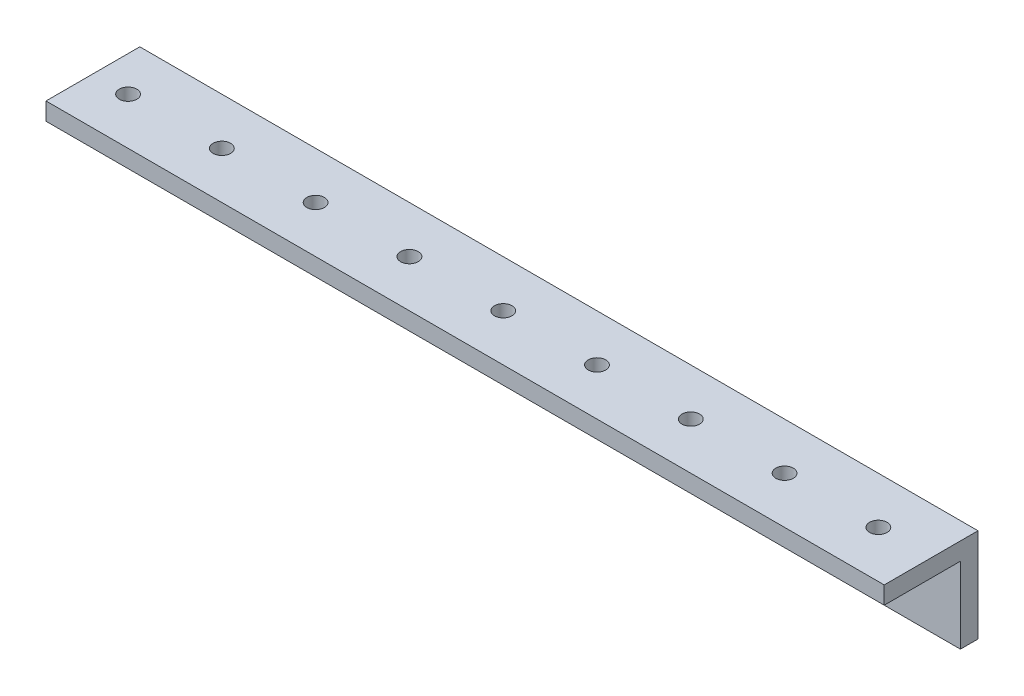
ISO-10303-21;
HEADER;
FILE_DESCRIPTION(('STEP AP214'),'2;1');
FILE_NAME('part.step','',(''),(''),'','','');
FILE_SCHEMA(('AUTOMOTIVE_DESIGN { 1 0 10303 214 1 1 1 1 }'));
ENDSEC;
DATA;
#1=APPLICATION_CONTEXT('core data for automotive mechanical design processes');
#2=APPLICATION_PROTOCOL_DEFINITION('international standard','automotive_design',2000,#1);
#3=PRODUCT_CONTEXT('',#1,'mechanical');
#4=PRODUCT('Part','Part','',(#3));
#5=PRODUCT_RELATED_PRODUCT_CATEGORY('part','',(#4));
#6=PRODUCT_DEFINITION_FORMATION('','',#4);
#7=PRODUCT_DEFINITION_CONTEXT('part definition',#1,'design');
#8=PRODUCT_DEFINITION('design','',#6,#7);
#9=PRODUCT_DEFINITION_SHAPE('','',#8);
#10=(LENGTH_UNIT() NAMED_UNIT(*) SI_UNIT(.MILLI.,.METRE.));
#11=(NAMED_UNIT(*) PLANE_ANGLE_UNIT() SI_UNIT($,.RADIAN.));
#12=(NAMED_UNIT(*) SI_UNIT($,.STERADIAN.) SOLID_ANGLE_UNIT());
#13=UNCERTAINTY_MEASURE_WITH_UNIT(LENGTH_MEASURE(1.E-05),#10,'distance_accuracy_value','');
#14=(GEOMETRIC_REPRESENTATION_CONTEXT(3) GLOBAL_UNCERTAINTY_ASSIGNED_CONTEXT((#13)) GLOBAL_UNIT_ASSIGNED_CONTEXT((#10,
#11,#12)) REPRESENTATION_CONTEXT('',''));
#15=CARTESIAN_POINT('',(0.,0.,0.));
#16=DIRECTION('',(0.,0.,1.));
#17=DIRECTION('',(1.,0.,0.));
#18=AXIS2_PLACEMENT_3D('',#15,#16,#17);
#19=CARTESIAN_POINT('',(5.99999999999998,6.,8.));
#20=DIRECTION('',(0.,1.,0.));
#21=DIRECTION('',(0.,0.,1.));
#22=AXIS2_PLACEMENT_3D('',#19,#20,#21);
#23=CYLINDRICAL_SURFACE('',#22,1.5);
#24=CARTESIAN_POINT('',(5.99999999999998,16.,8.));
#25=DIRECTION('',(0.,1.,0.));
#26=DIRECTION('',(0.,0.,1.));
#27=AXIS2_PLACEMENT_3D('',#24,#25,#26);
#28=CIRCLE('',#27,1.5);
#29=CARTESIAN_POINT('',(5.99999999999998,16.,9.5));
#30=VERTEX_POINT('',#29);
#31=EDGE_CURVE('E40',#30,#30,#28,.T.);
#32=ORIENTED_EDGE('',*,*,#31,.T.);
#33=EDGE_LOOP('',(#32));
#34=FACE_BOUND('',#33,.T.);
#35=CARTESIAN_POINT('',(5.99999999999998,13.,8.));
#36=DIRECTION('',(0.,1.,0.));
#37=DIRECTION('',(0.,0.,1.));
#38=AXIS2_PLACEMENT_3D('',#35,#36,#37);
#39=CIRCLE('',#38,1.5);
#40=CARTESIAN_POINT('',(5.99999999999998,13.,9.5));
#41=VERTEX_POINT('',#40);
#42=EDGE_CURVE('E11',#41,#41,#39,.T.);
#43=ORIENTED_EDGE('',*,*,#42,.F.);
#44=EDGE_LOOP('',(#43));
#45=FACE_BOUND('',#44,.T.);
#46=ADVANCED_FACE('F33',(#34,#45),#23,.F.);
#47=CARTESIAN_POINT('',(22.,6.,8.));
#48=DIRECTION('',(0.,1.,0.));
#49=DIRECTION('',(0.,0.,1.));
#50=AXIS2_PLACEMENT_3D('',#47,#48,#49);
#51=CYLINDRICAL_SURFACE('',#50,1.5);
#52=CARTESIAN_POINT('',(22.,16.,8.));
#53=DIRECTION('',(0.,1.,0.));
#54=DIRECTION('',(0.,0.,1.));
#55=AXIS2_PLACEMENT_3D('',#52,#53,#54);
#56=CIRCLE('',#55,1.5);
#57=CARTESIAN_POINT('',(22.,16.,9.5));
#58=VERTEX_POINT('',#57);
#59=EDGE_CURVE('E196',#58,#58,#56,.T.);
#60=ORIENTED_EDGE('',*,*,#59,.T.);
#61=EDGE_LOOP('',(#60));
#62=FACE_BOUND('',#61,.T.);
#63=CARTESIAN_POINT('',(22.,13.,8.));
#64=DIRECTION('',(0.,1.,0.));
#65=DIRECTION('',(0.,0.,1.));
#66=AXIS2_PLACEMENT_3D('',#63,#64,#65);
#67=CIRCLE('',#66,1.5);
#68=CARTESIAN_POINT('',(22.,13.,9.5));
#69=VERTEX_POINT('',#68);
#70=EDGE_CURVE('E199',#69,#69,#67,.T.);
#71=ORIENTED_EDGE('',*,*,#70,.F.);
#72=EDGE_LOOP('',(#71));
#73=FACE_BOUND('',#72,.T.);
#74=ADVANCED_FACE('F225',(#62,#73),#51,.F.);
#75=CARTESIAN_POINT('',(38.,6.,8.));
#76=DIRECTION('',(0.,1.,0.));
#77=DIRECTION('',(0.,0.,1.));
#78=AXIS2_PLACEMENT_3D('',#75,#76,#77);
#79=CYLINDRICAL_SURFACE('',#78,1.5);
#80=CARTESIAN_POINT('',(38.,16.,8.));
#81=DIRECTION('',(0.,1.,0.));
#82=DIRECTION('',(0.,0.,1.));
#83=AXIS2_PLACEMENT_3D('',#80,#81,#82);
#84=CIRCLE('',#83,1.5);
#85=CARTESIAN_POINT('',(38.,16.,9.5));
#86=VERTEX_POINT('',#85);
#87=EDGE_CURVE('E190',#86,#86,#84,.T.);
#88=ORIENTED_EDGE('',*,*,#87,.T.);
#89=EDGE_LOOP('',(#88));
#90=FACE_BOUND('',#89,.T.);
#91=CARTESIAN_POINT('',(38.,13.,8.));
#92=DIRECTION('',(0.,1.,0.));
#93=DIRECTION('',(0.,0.,1.));
#94=AXIS2_PLACEMENT_3D('',#91,#92,#93);
#95=CIRCLE('',#94,1.5);
#96=CARTESIAN_POINT('',(38.,13.,9.5));
#97=VERTEX_POINT('',#96);
#98=EDGE_CURVE('E193',#97,#97,#95,.T.);
#99=ORIENTED_EDGE('',*,*,#98,.F.);
#100=EDGE_LOOP('',(#99));
#101=FACE_BOUND('',#100,.T.);
#102=ADVANCED_FACE('F230',(#90,#101),#79,.F.);
#103=CARTESIAN_POINT('',(54.,6.,8.));
#104=DIRECTION('',(0.,1.,0.));
#105=DIRECTION('',(0.,0.,1.));
#106=AXIS2_PLACEMENT_3D('',#103,#104,#105);
#107=CYLINDRICAL_SURFACE('',#106,1.5);
#108=CARTESIAN_POINT('',(54.,16.,8.));
#109=DIRECTION('',(0.,1.,0.));
#110=DIRECTION('',(0.,0.,1.));
#111=AXIS2_PLACEMENT_3D('',#108,#109,#110);
#112=CIRCLE('',#111,1.5);
#113=CARTESIAN_POINT('',(54.,16.,9.5));
#114=VERTEX_POINT('',#113);
#115=EDGE_CURVE('E184',#114,#114,#112,.T.);
#116=ORIENTED_EDGE('',*,*,#115,.T.);
#117=EDGE_LOOP('',(#116));
#118=FACE_BOUND('',#117,.T.);
#119=CARTESIAN_POINT('',(54.,13.,8.));
#120=DIRECTION('',(0.,1.,0.));
#121=DIRECTION('',(0.,0.,1.));
#122=AXIS2_PLACEMENT_3D('',#119,#120,#121);
#123=CIRCLE('',#122,1.5);
#124=CARTESIAN_POINT('',(54.,13.,9.5));
#125=VERTEX_POINT('',#124);
#126=EDGE_CURVE('E187',#125,#125,#123,.T.);
#127=ORIENTED_EDGE('',*,*,#126,.F.);
#128=EDGE_LOOP('',(#127));
#129=FACE_BOUND('',#128,.T.);
#130=ADVANCED_FACE('F235',(#118,#129),#107,.F.);
#131=CARTESIAN_POINT('',(70.,6.,8.));
#132=DIRECTION('',(0.,1.,0.));
#133=DIRECTION('',(0.,0.,1.));
#134=AXIS2_PLACEMENT_3D('',#131,#132,#133);
#135=CYLINDRICAL_SURFACE('',#134,1.5);
#136=CARTESIAN_POINT('',(70.,16.,8.));
#137=DIRECTION('',(0.,1.,0.));
#138=DIRECTION('',(0.,0.,1.));
#139=AXIS2_PLACEMENT_3D('',#136,#137,#138);
#140=CIRCLE('',#139,1.5);
#141=CARTESIAN_POINT('',(70.,16.,9.5));
#142=VERTEX_POINT('',#141);
#143=EDGE_CURVE('E178',#142,#142,#140,.T.);
#144=ORIENTED_EDGE('',*,*,#143,.T.);
#145=EDGE_LOOP('',(#144));
#146=FACE_BOUND('',#145,.T.);
#147=CARTESIAN_POINT('',(70.,13.,8.));
#148=DIRECTION('',(0.,1.,0.));
#149=DIRECTION('',(0.,0.,1.));
#150=AXIS2_PLACEMENT_3D('',#147,#148,#149);
#151=CIRCLE('',#150,1.5);
#152=CARTESIAN_POINT('',(70.,13.,9.5));
#153=VERTEX_POINT('',#152);
#154=EDGE_CURVE('E181',#153,#153,#151,.T.);
#155=ORIENTED_EDGE('',*,*,#154,.F.);
#156=EDGE_LOOP('',(#155));
#157=FACE_BOUND('',#156,.T.);
#158=ADVANCED_FACE('F242',(#146,#157),#135,.F.);
#159=CARTESIAN_POINT('',(86.,6.,8.));
#160=DIRECTION('',(0.,1.,0.));
#161=DIRECTION('',(0.,0.,1.));
#162=AXIS2_PLACEMENT_3D('',#159,#160,#161);
#163=CYLINDRICAL_SURFACE('',#162,1.5);
#164=CARTESIAN_POINT('',(86.,16.,8.));
#165=DIRECTION('',(0.,1.,0.));
#166=DIRECTION('',(0.,0.,1.));
#167=AXIS2_PLACEMENT_3D('',#164,#165,#166);
#168=CIRCLE('',#167,1.5);
#169=CARTESIAN_POINT('',(86.,16.,9.5));
#170=VERTEX_POINT('',#169);
#171=EDGE_CURVE('E172',#170,#170,#168,.T.);
#172=ORIENTED_EDGE('',*,*,#171,.T.);
#173=EDGE_LOOP('',(#172));
#174=FACE_BOUND('',#173,.T.);
#175=CARTESIAN_POINT('',(86.,13.,8.));
#176=DIRECTION('',(0.,1.,0.));
#177=DIRECTION('',(0.,0.,1.));
#178=AXIS2_PLACEMENT_3D('',#175,#176,#177);
#179=CIRCLE('',#178,1.5);
#180=CARTESIAN_POINT('',(86.,13.,9.5));
#181=VERTEX_POINT('',#180);
#182=EDGE_CURVE('E175',#181,#181,#179,.T.);
#183=ORIENTED_EDGE('',*,*,#182,.F.);
#184=EDGE_LOOP('',(#183));
#185=FACE_BOUND('',#184,.T.);
#186=ADVANCED_FACE('F246',(#174,#185),#163,.F.);
#187=CARTESIAN_POINT('',(102.,6.,8.));
#188=DIRECTION('',(0.,1.,0.));
#189=DIRECTION('',(0.,0.,1.));
#190=AXIS2_PLACEMENT_3D('',#187,#188,#189);
#191=CYLINDRICAL_SURFACE('',#190,1.5);
#192=CARTESIAN_POINT('',(102.,16.,8.));
#193=DIRECTION('',(0.,1.,0.));
#194=DIRECTION('',(0.,0.,1.));
#195=AXIS2_PLACEMENT_3D('',#192,#193,#194);
#196=CIRCLE('',#195,1.5);
#197=CARTESIAN_POINT('',(102.,16.,9.5));
#198=VERTEX_POINT('',#197);
#199=EDGE_CURVE('E161',#198,#198,#196,.T.);
#200=ORIENTED_EDGE('',*,*,#199,.T.);
#201=EDGE_LOOP('',(#200));
#202=FACE_BOUND('',#201,.T.);
#203=CARTESIAN_POINT('',(102.,13.,8.));
#204=DIRECTION('',(0.,1.,0.));
#205=DIRECTION('',(0.,0.,1.));
#206=AXIS2_PLACEMENT_3D('',#203,#204,#205);
#207=CIRCLE('',#206,1.5);
#208=CARTESIAN_POINT('',(102.,13.,9.5));
#209=VERTEX_POINT('',#208);
#210=EDGE_CURVE('E169',#209,#209,#207,.T.);
#211=ORIENTED_EDGE('',*,*,#210,.F.);
#212=EDGE_LOOP('',(#211));
#213=FACE_BOUND('',#212,.T.);
#214=ADVANCED_FACE('F250',(#202,#213),#191,.F.);
#215=CARTESIAN_POINT('',(5.99999999999998,8.,10.));
#216=DIRECTION('',(0.,0.,-1.));
#217=DIRECTION('',(-1.,0.,0.));
#218=AXIS2_PLACEMENT_3D('',#215,#216,#217);
#219=CYLINDRICAL_SURFACE('',#218,1.5);
#220=CARTESIAN_POINT('',(5.99999999999998,8.,0.));
#221=DIRECTION('',(0.,0.,-1.));
#222=DIRECTION('',(-1.,0.,0.));
#223=AXIS2_PLACEMENT_3D('',#220,#221,#222);
#224=CIRCLE('',#223,1.5);
#225=CARTESIAN_POINT('',(4.49999999999998,8.,0.));
#226=VERTEX_POINT('',#225);
#227=EDGE_CURVE('E155',#226,#226,#224,.T.);
#228=ORIENTED_EDGE('',*,*,#227,.T.);
#229=EDGE_LOOP('',(#228));
#230=FACE_BOUND('',#229,.T.);
#231=CARTESIAN_POINT('',(5.99999999999998,8.,3.));
#232=DIRECTION('',(0.,0.,-1.));
#233=DIRECTION('',(-1.,0.,0.));
#234=AXIS2_PLACEMENT_3D('',#231,#232,#233);
#235=CIRCLE('',#234,1.5);
#236=CARTESIAN_POINT('',(4.49999999999998,8.,3.));
#237=VERTEX_POINT('',#236);
#238=EDGE_CURVE('E158',#237,#237,#235,.T.);
#239=ORIENTED_EDGE('',*,*,#238,.F.);
#240=EDGE_LOOP('',(#239));
#241=FACE_BOUND('',#240,.T.);
#242=ADVANCED_FACE('F254',(#230,#241),#219,.F.);
#243=CARTESIAN_POINT('',(22.,8.,10.));
#244=DIRECTION('',(0.,0.,-1.));
#245=DIRECTION('',(-1.,0.,0.));
#246=AXIS2_PLACEMENT_3D('',#243,#244,#245);
#247=CYLINDRICAL_SURFACE('',#246,1.5);
#248=CARTESIAN_POINT('',(22.,8.,0.));
#249=DIRECTION('',(0.,0.,-1.));
#250=DIRECTION('',(-1.,0.,0.));
#251=AXIS2_PLACEMENT_3D('',#248,#249,#250);
#252=CIRCLE('',#251,1.5);
#253=CARTESIAN_POINT('',(20.5,8.,0.));
#254=VERTEX_POINT('',#253);
#255=EDGE_CURVE('E149',#254,#254,#252,.T.);
#256=ORIENTED_EDGE('',*,*,#255,.T.);
#257=EDGE_LOOP('',(#256));
#258=FACE_BOUND('',#257,.T.);
#259=CARTESIAN_POINT('',(22.,8.,3.));
#260=DIRECTION('',(0.,0.,-1.));
#261=DIRECTION('',(-1.,0.,0.));
#262=AXIS2_PLACEMENT_3D('',#259,#260,#261);
#263=CIRCLE('',#262,1.5);
#264=CARTESIAN_POINT('',(20.5,8.,3.));
#265=VERTEX_POINT('',#264);
#266=EDGE_CURVE('E152',#265,#265,#263,.T.);
#267=ORIENTED_EDGE('',*,*,#266,.F.);
#268=EDGE_LOOP('',(#267));
#269=FACE_BOUND('',#268,.T.);
#270=ADVANCED_FACE('F258',(#258,#269),#247,.F.);
#271=CARTESIAN_POINT('',(38.,8.,10.));
#272=DIRECTION('',(0.,0.,-1.));
#273=DIRECTION('',(-1.,0.,0.));
#274=AXIS2_PLACEMENT_3D('',#271,#272,#273);
#275=CYLINDRICAL_SURFACE('',#274,1.5);
#276=CARTESIAN_POINT('',(38.,8.,0.));
#277=DIRECTION('',(0.,0.,-1.));
#278=DIRECTION('',(-1.,0.,0.));
#279=AXIS2_PLACEMENT_3D('',#276,#277,#278);
#280=CIRCLE('',#279,1.5);
#281=CARTESIAN_POINT('',(36.5,8.,0.));
#282=VERTEX_POINT('',#281);
#283=EDGE_CURVE('E143',#282,#282,#280,.T.);
#284=ORIENTED_EDGE('',*,*,#283,.T.);
#285=EDGE_LOOP('',(#284));
#286=FACE_BOUND('',#285,.T.);
#287=CARTESIAN_POINT('',(38.,8.,3.));
#288=DIRECTION('',(0.,0.,-1.));
#289=DIRECTION('',(-1.,0.,0.));
#290=AXIS2_PLACEMENT_3D('',#287,#288,#289);
#291=CIRCLE('',#290,1.5);
#292=CARTESIAN_POINT('',(36.5,8.,3.));
#293=VERTEX_POINT('',#292);
#294=EDGE_CURVE('E146',#293,#293,#291,.T.);
#295=ORIENTED_EDGE('',*,*,#294,.F.);
#296=EDGE_LOOP('',(#295));
#297=FACE_BOUND('',#296,.T.);
#298=ADVANCED_FACE('F262',(#286,#297),#275,.F.);
#299=CARTESIAN_POINT('',(54.,8.,10.));
#300=DIRECTION('',(0.,0.,-1.));
#301=DIRECTION('',(-1.,0.,0.));
#302=AXIS2_PLACEMENT_3D('',#299,#300,#301);
#303=CYLINDRICAL_SURFACE('',#302,1.5);
#304=CARTESIAN_POINT('',(54.,8.,0.));
#305=DIRECTION('',(0.,0.,-1.));
#306=DIRECTION('',(-1.,0.,0.));
#307=AXIS2_PLACEMENT_3D('',#304,#305,#306);
#308=CIRCLE('',#307,1.5);
#309=CARTESIAN_POINT('',(52.5,8.,0.));
#310=VERTEX_POINT('',#309);
#311=EDGE_CURVE('E137',#310,#310,#308,.T.);
#312=ORIENTED_EDGE('',*,*,#311,.T.);
#313=EDGE_LOOP('',(#312));
#314=FACE_BOUND('',#313,.T.);
#315=CARTESIAN_POINT('',(54.,8.,3.));
#316=DIRECTION('',(0.,0.,-1.));
#317=DIRECTION('',(-1.,0.,0.));
#318=AXIS2_PLACEMENT_3D('',#315,#316,#317);
#319=CIRCLE('',#318,1.5);
#320=CARTESIAN_POINT('',(52.5,8.,3.));
#321=VERTEX_POINT('',#320);
#322=EDGE_CURVE('E140',#321,#321,#319,.T.);
#323=ORIENTED_EDGE('',*,*,#322,.F.);
#324=EDGE_LOOP('',(#323));
#325=FACE_BOUND('',#324,.T.);
#326=ADVANCED_FACE('F266',(#314,#325),#303,.F.);
#327=CARTESIAN_POINT('',(70.,8.,10.));
#328=DIRECTION('',(0.,0.,-1.));
#329=DIRECTION('',(-1.,0.,0.));
#330=AXIS2_PLACEMENT_3D('',#327,#328,#329);
#331=CYLINDRICAL_SURFACE('',#330,1.5);
#332=CARTESIAN_POINT('',(70.,8.,0.));
#333=DIRECTION('',(0.,0.,-1.));
#334=DIRECTION('',(-1.,0.,0.));
#335=AXIS2_PLACEMENT_3D('',#332,#333,#334);
#336=CIRCLE('',#335,1.5);
#337=CARTESIAN_POINT('',(68.5,8.,0.));
#338=VERTEX_POINT('',#337);
#339=EDGE_CURVE('E131',#338,#338,#336,.T.);
#340=ORIENTED_EDGE('',*,*,#339,.T.);
#341=EDGE_LOOP('',(#340));
#342=FACE_BOUND('',#341,.T.);
#343=CARTESIAN_POINT('',(70.,8.,3.));
#344=DIRECTION('',(0.,0.,-1.));
#345=DIRECTION('',(-1.,0.,0.));
#346=AXIS2_PLACEMENT_3D('',#343,#344,#345);
#347=CIRCLE('',#346,1.5);
#348=CARTESIAN_POINT('',(68.5,8.,3.));
#349=VERTEX_POINT('',#348);
#350=EDGE_CURVE('E134',#349,#349,#347,.T.);
#351=ORIENTED_EDGE('',*,*,#350,.F.);
#352=EDGE_LOOP('',(#351));
#353=FACE_BOUND('',#352,.T.);
#354=ADVANCED_FACE('F270',(#342,#353),#331,.F.);
#355=CARTESIAN_POINT('',(86.,8.,10.));
#356=DIRECTION('',(0.,0.,-1.));
#357=DIRECTION('',(-1.,0.,0.));
#358=AXIS2_PLACEMENT_3D('',#355,#356,#357);
#359=CYLINDRICAL_SURFACE('',#358,1.5);
#360=CARTESIAN_POINT('',(86.,8.,0.));
#361=DIRECTION('',(0.,0.,-1.));
#362=DIRECTION('',(-1.,0.,0.));
#363=AXIS2_PLACEMENT_3D('',#360,#361,#362);
#364=CIRCLE('',#363,1.5);
#365=CARTESIAN_POINT('',(84.5,8.,0.));
#366=VERTEX_POINT('',#365);
#367=EDGE_CURVE('E125',#366,#366,#364,.T.);
#368=ORIENTED_EDGE('',*,*,#367,.T.);
#369=EDGE_LOOP('',(#368));
#370=FACE_BOUND('',#369,.T.);
#371=CARTESIAN_POINT('',(86.,8.,3.));
#372=DIRECTION('',(0.,0.,-1.));
#373=DIRECTION('',(-1.,0.,0.));
#374=AXIS2_PLACEMENT_3D('',#371,#372,#373);
#375=CIRCLE('',#374,1.5);
#376=CARTESIAN_POINT('',(84.5,8.,3.));
#377=VERTEX_POINT('',#376);
#378=EDGE_CURVE('E128',#377,#377,#375,.T.);
#379=ORIENTED_EDGE('',*,*,#378,.F.);
#380=EDGE_LOOP('',(#379));
#381=FACE_BOUND('',#380,.T.);
#382=ADVANCED_FACE('F274',(#370,#381),#359,.F.);
#383=CARTESIAN_POINT('',(102.,8.,10.));
#384=DIRECTION('',(0.,0.,-1.));
#385=DIRECTION('',(-1.,0.,0.));
#386=AXIS2_PLACEMENT_3D('',#383,#384,#385);
#387=CYLINDRICAL_SURFACE('',#386,1.5);
#388=CARTESIAN_POINT('',(102.,8.,0.));
#389=DIRECTION('',(0.,0.,-1.));
#390=DIRECTION('',(-1.,0.,0.));
#391=AXIS2_PLACEMENT_3D('',#388,#389,#390);
#392=CIRCLE('',#391,1.5);
#393=CARTESIAN_POINT('',(100.5,8.,0.));
#394=VERTEX_POINT('',#393);
#395=EDGE_CURVE('E119',#394,#394,#392,.T.);
#396=ORIENTED_EDGE('',*,*,#395,.T.);
#397=EDGE_LOOP('',(#396));
#398=FACE_BOUND('',#397,.T.);
#399=CARTESIAN_POINT('',(102.,8.,3.));
#400=DIRECTION('',(0.,0.,-1.));
#401=DIRECTION('',(-1.,0.,0.));
#402=AXIS2_PLACEMENT_3D('',#399,#400,#401);
#403=CIRCLE('',#402,1.5);
#404=CARTESIAN_POINT('',(100.5,8.,3.));
#405=VERTEX_POINT('',#404);
#406=EDGE_CURVE('E122',#405,#405,#403,.T.);
#407=ORIENTED_EDGE('',*,*,#406,.F.);
#408=EDGE_LOOP('',(#407));
#409=FACE_BOUND('',#408,.T.);
#410=ADVANCED_FACE('F278',(#398,#409),#387,.F.);
#411=CARTESIAN_POINT('',(0.,0.,3.));
#412=DIRECTION('',(0.,0.,-1.));
#413=DIRECTION('',(-1.,0.,0.));
#414=AXIS2_PLACEMENT_3D('',#411,#412,#413);
#415=PLANE('',#414);
#416=CARTESIAN_POINT('',(118.,8.,3.));
#417=DIRECTION('',(0.,0.,-1.));
#418=DIRECTION('',(-1.,0.,0.));
#419=AXIS2_PLACEMENT_3D('',#416,#417,#418);
#420=CIRCLE('',#419,1.5);
#421=CARTESIAN_POINT('',(116.5,8.,3.));
#422=VERTEX_POINT('',#421);
#423=EDGE_CURVE('E314',#422,#422,#420,.T.);
#424=ORIENTED_EDGE('',*,*,#423,.T.);
#425=EDGE_LOOP('',(#424));
#426=FACE_BOUND('',#425,.T.);
#427=CARTESIAN_POINT('',(134.,8.,3.));
#428=DIRECTION('',(0.,0.,-1.));
#429=DIRECTION('',(-1.,0.,0.));
#430=AXIS2_PLACEMENT_3D('',#427,#428,#429);
#431=CIRCLE('',#430,1.5);
#432=CARTESIAN_POINT('',(132.5,8.,3.));
#433=VERTEX_POINT('',#432);
#434=EDGE_CURVE('E300',#433,#433,#431,.T.);
#435=ORIENTED_EDGE('',*,*,#434,.T.);
#436=EDGE_LOOP('',(#435));
#437=FACE_BOUND('',#436,.T.);
#438=DIRECTION('',(1.,0.,0.));
#439=VECTOR('',#438,1.);
#440=CARTESIAN_POINT('',(0.,13.,3.));
#441=LINE('',#440,#439);
#442=CARTESIAN_POINT('',(0.,13.,3.));
#443=VERTEX_POINT('',#442);
#444=CARTESIAN_POINT('',(143.,13.,3.));
#445=VERTEX_POINT('',#444);
#446=EDGE_CURVE('E47',#443,#445,#441,.T.);
#447=ORIENTED_EDGE('',*,*,#446,.F.);
#448=DIRECTION('',(0.,-1.,0.));
#449=VECTOR('',#448,1.);
#450=CARTESIAN_POINT('',(0.,0.,3.));
#451=LINE('',#450,#449);
#452=CARTESIAN_POINT('',(0.,0.,3.));
#453=VERTEX_POINT('',#452);
#454=EDGE_CURVE('E85',#443,#453,#451,.T.);
#455=ORIENTED_EDGE('',*,*,#454,.T.);
#456=DIRECTION('',(1.,0.,0.));
#457=VECTOR('',#456,1.);
#458=CARTESIAN_POINT('',(0.,0.,3.));
#459=LINE('',#458,#457);
#460=CARTESIAN_POINT('',(143.,0.,3.));
#461=VERTEX_POINT('',#460);
#462=EDGE_CURVE('E53',#453,#461,#459,.T.);
#463=ORIENTED_EDGE('',*,*,#462,.T.);
#464=DIRECTION('',(0.,1.,0.));
#465=VECTOR('',#464,1.);
#466=CARTESIAN_POINT('',(143.,0.,3.));
#467=LINE('',#466,#465);
#468=EDGE_CURVE('E97',#461,#445,#467,.T.);
#469=ORIENTED_EDGE('',*,*,#468,.T.);
#470=EDGE_LOOP('',(#447,#455,#463,#469));
#471=FACE_BOUND('',#470,.T.);
#472=ORIENTED_EDGE('',*,*,#406,.T.);
#473=EDGE_LOOP('',(#472));
#474=FACE_BOUND('',#473,.T.);
#475=ORIENTED_EDGE('',*,*,#378,.T.);
#476=EDGE_LOOP('',(#475));
#477=FACE_BOUND('',#476,.T.);
#478=ORIENTED_EDGE('',*,*,#350,.T.);
#479=EDGE_LOOP('',(#478));
#480=FACE_BOUND('',#479,.T.);
#481=ORIENTED_EDGE('',*,*,#322,.T.);
#482=EDGE_LOOP('',(#481));
#483=FACE_BOUND('',#482,.T.);
#484=ORIENTED_EDGE('',*,*,#294,.T.);
#485=EDGE_LOOP('',(#484));
#486=FACE_BOUND('',#485,.T.);
#487=ORIENTED_EDGE('',*,*,#266,.T.);
#488=EDGE_LOOP('',(#487));
#489=FACE_BOUND('',#488,.T.);
#490=ORIENTED_EDGE('',*,*,#238,.T.);
#491=EDGE_LOOP('',(#490));
#492=FACE_BOUND('',#491,.T.);
#493=ADVANCED_FACE('F282',(#426,#437,#471,#474,#477,#480,#483,#486,#489,#492),#415,.F.);
#494=CARTESIAN_POINT('',(0.,0.,3.));
#495=DIRECTION('',(1.,0.,0.));
#496=DIRECTION('',(0.,0.,-1.));
#497=AXIS2_PLACEMENT_3D('',#494,#495,#496);
#498=PLANE('',#497);
#499=DIRECTION('',(0.,-1.,0.));
#500=VECTOR('',#499,1.);
#501=CARTESIAN_POINT('',(0.,0.,0.));
#502=LINE('',#501,#500);
#503=CARTESIAN_POINT('',(0.,16.,0.));
#504=VERTEX_POINT('',#503);
#505=CARTESIAN_POINT('',(0.,0.,0.));
#506=VERTEX_POINT('',#505);
#507=EDGE_CURVE('E93',#504,#506,#502,.T.);
#508=ORIENTED_EDGE('',*,*,#507,.T.);
#509=DIRECTION('',(0.,0.,-1.));
#510=VECTOR('',#509,1.);
#511=CARTESIAN_POINT('',(0.,0.,3.));
#512=LINE('',#511,#510);
#513=EDGE_CURVE('E117',#453,#506,#512,.T.);
#514=ORIENTED_EDGE('',*,*,#513,.F.);
#515=ORIENTED_EDGE('',*,*,#454,.F.);
#516=DIRECTION('',(0.,0.,-1.));
#517=VECTOR('',#516,1.);
#518=CARTESIAN_POINT('',(0.,13.,16.));
#519=LINE('',#518,#517);
#520=CARTESIAN_POINT('',(0.,13.,16.));
#521=VERTEX_POINT('',#520);
#522=EDGE_CURVE('E103',#521,#443,#519,.T.);
#523=ORIENTED_EDGE('',*,*,#522,.F.);
#524=DIRECTION('',(0.,-1.,0.));
#525=VECTOR('',#524,1.);
#526=CARTESIAN_POINT('',(0.,16.,16.));
#527=LINE('',#526,#525);
#528=CARTESIAN_POINT('',(0.,16.,16.));
#529=VERTEX_POINT('',#528);
#530=EDGE_CURVE('E96',#529,#521,#527,.T.);
#531=ORIENTED_EDGE('',*,*,#530,.F.);
#532=DIRECTION('',(0.,0.,-1.));
#533=VECTOR('',#532,1.);
#534=CARTESIAN_POINT('',(0.,16.,3.));
#535=LINE('',#534,#533);
#536=EDGE_CURVE('E78',#529,#504,#535,.T.);
#537=ORIENTED_EDGE('',*,*,#536,.T.);
#538=EDGE_LOOP('',(#508,#514,#515,#523,#531,#537));
#539=FACE_BOUND('',#538,.T.);
#540=ADVANCED_FACE('F91',(#539),#498,.F.);
#541=CARTESIAN_POINT('',(0.,0.,3.));
#542=DIRECTION('',(0.,1.,0.));
#543=DIRECTION('',(0.,0.,1.));
#544=AXIS2_PLACEMENT_3D('',#541,#542,#543);
#545=PLANE('',#544);
#546=DIRECTION('',(1.,0.,0.));
#547=VECTOR('',#546,1.);
#548=CARTESIAN_POINT('',(0.,0.,0.));
#549=LINE('',#548,#547);
#550=CARTESIAN_POINT('',(143.,0.,0.));
#551=VERTEX_POINT('',#550);
#552=EDGE_CURVE('E101',#506,#551,#549,.T.);
#553=ORIENTED_EDGE('',*,*,#552,.T.);
#554=DIRECTION('',(0.,0.,-1.));
#555=VECTOR('',#554,1.);
#556=CARTESIAN_POINT('',(143.,0.,3.));
#557=LINE('',#556,#555);
#558=EDGE_CURVE('E114',#461,#551,#557,.T.);
#559=ORIENTED_EDGE('',*,*,#558,.F.);
#560=ORIENTED_EDGE('',*,*,#462,.F.);
#561=ORIENTED_EDGE('',*,*,#513,.T.);
#562=EDGE_LOOP('',(#553,#559,#560,#561));
#563=FACE_BOUND('',#562,.T.);
#564=ADVANCED_FACE('F219',(#563),#545,.F.);
#565=CARTESIAN_POINT('',(143.,0.,3.));
#566=DIRECTION('',(-1.,0.,0.));
#567=DIRECTION('',(0.,0.,1.));
#568=AXIS2_PLACEMENT_3D('',#565,#566,#567);
#569=PLANE('',#568);
#570=DIRECTION('',(0.,1.,0.));
#571=VECTOR('',#570,1.);
#572=CARTESIAN_POINT('',(143.,0.,0.));
#573=LINE('',#572,#571);
#574=CARTESIAN_POINT('',(143.,16.,0.));
#575=VERTEX_POINT('',#574);
#576=EDGE_CURVE('E86',#551,#575,#573,.T.);
#577=ORIENTED_EDGE('',*,*,#576,.T.);
#578=DIRECTION('',(0.,0.,-1.));
#579=VECTOR('',#578,1.);
#580=CARTESIAN_POINT('',(143.,16.,3.));
#581=LINE('',#580,#579);
#582=CARTESIAN_POINT('',(143.,16.,16.));
#583=VERTEX_POINT('',#582);
#584=EDGE_CURVE('E81',#583,#575,#581,.T.);
#585=ORIENTED_EDGE('',*,*,#584,.F.);
#586=DIRECTION('',(0.,1.,0.));
#587=VECTOR('',#586,1.);
#588=CARTESIAN_POINT('',(143.,16.,16.));
#589=LINE('',#588,#587);
#590=CARTESIAN_POINT('',(143.,13.,16.));
#591=VERTEX_POINT('',#590);
#592=EDGE_CURVE('E302',#591,#583,#589,.T.);
#593=ORIENTED_EDGE('',*,*,#592,.F.);
#594=DIRECTION('',(0.,0.,-1.));
#595=VECTOR('',#594,1.);
#596=CARTESIAN_POINT('',(143.,13.,16.));
#597=LINE('',#596,#595);
#598=EDGE_CURVE('E107',#591,#445,#597,.T.);
#599=ORIENTED_EDGE('',*,*,#598,.T.);
#600=ORIENTED_EDGE('',*,*,#468,.F.);
#601=ORIENTED_EDGE('',*,*,#558,.T.);
#602=EDGE_LOOP('',(#577,#585,#593,#599,#600,#601));
#603=FACE_BOUND('',#602,.T.);
#604=ADVANCED_FACE('F207',(#603),#569,.F.);
#605=CARTESIAN_POINT('',(0.,16.,3.));
#606=DIRECTION('',(0.,-1.,0.));
#607=DIRECTION('',(0.,0.,-1.));
#608=AXIS2_PLACEMENT_3D('',#605,#606,#607);
#609=PLANE('',#608);
#610=CARTESIAN_POINT('',(118.,16.,8.));
#611=DIRECTION('',(0.,1.,0.));
#612=DIRECTION('',(0.,0.,1.));
#613=AXIS2_PLACEMENT_3D('',#610,#611,#612);
#614=CIRCLE('',#613,1.5);
#615=CARTESIAN_POINT('',(118.,16.,9.5));
#616=VERTEX_POINT('',#615);
#617=EDGE_CURVE('E324',#616,#616,#614,.T.);
#618=ORIENTED_EDGE('',*,*,#617,.F.);
#619=EDGE_LOOP('',(#618));
#620=FACE_BOUND('',#619,.T.);
#621=CARTESIAN_POINT('',(134.,16.,8.));
#622=DIRECTION('',(0.,1.,0.));
#623=DIRECTION('',(0.,0.,1.));
#624=AXIS2_PLACEMENT_3D('',#621,#622,#623);
#625=CIRCLE('',#624,1.5);
#626=CARTESIAN_POINT('',(134.,16.,9.5));
#627=VERTEX_POINT('',#626);
#628=EDGE_CURVE('E166',#627,#627,#625,.T.);
#629=ORIENTED_EDGE('',*,*,#628,.F.);
#630=EDGE_LOOP('',(#629));
#631=FACE_BOUND('',#630,.T.);
#632=DIRECTION('',(-1.,0.,0.));
#633=VECTOR('',#632,1.);
#634=CARTESIAN_POINT('',(0.,16.,0.));
#635=LINE('',#634,#633);
#636=EDGE_CURVE('E73',#575,#504,#635,.T.);
#637=ORIENTED_EDGE('',*,*,#636,.T.);
#638=ORIENTED_EDGE('',*,*,#536,.F.);
#639=DIRECTION('',(-1.,0.,0.));
#640=VECTOR('',#639,1.);
#641=CARTESIAN_POINT('',(0.,16.,16.));
#642=LINE('',#641,#640);
#643=EDGE_CURVE('E298',#583,#529,#642,.T.);
#644=ORIENTED_EDGE('',*,*,#643,.F.);
#645=ORIENTED_EDGE('',*,*,#584,.T.);
#646=EDGE_LOOP('',(#637,#638,#644,#645));
#647=FACE_BOUND('',#646,.T.);
#648=ORIENTED_EDGE('',*,*,#199,.F.);
#649=EDGE_LOOP('',(#648));
#650=FACE_BOUND('',#649,.T.);
#651=ORIENTED_EDGE('',*,*,#171,.F.);
#652=EDGE_LOOP('',(#651));
#653=FACE_BOUND('',#652,.T.);
#654=ORIENTED_EDGE('',*,*,#143,.F.);
#655=EDGE_LOOP('',(#654));
#656=FACE_BOUND('',#655,.T.);
#657=ORIENTED_EDGE('',*,*,#115,.F.);
#658=EDGE_LOOP('',(#657));
#659=FACE_BOUND('',#658,.T.);
#660=ORIENTED_EDGE('',*,*,#87,.F.);
#661=EDGE_LOOP('',(#660));
#662=FACE_BOUND('',#661,.T.);
#663=ORIENTED_EDGE('',*,*,#59,.F.);
#664=EDGE_LOOP('',(#663));
#665=FACE_BOUND('',#664,.T.);
#666=ORIENTED_EDGE('',*,*,#31,.F.);
#667=EDGE_LOOP('',(#666));
#668=FACE_BOUND('',#667,.T.);
#669=ADVANCED_FACE('F75',(#620,#631,#647,#650,#653,#656,#659,#662,#665,#668),#609,.F.);
#670=CARTESIAN_POINT('',(0.,0.,0.));
#671=DIRECTION('',(0.,0.,-1.));
#672=DIRECTION('',(-1.,0.,0.));
#673=AXIS2_PLACEMENT_3D('',#670,#671,#672);
#674=PLANE('',#673);
#675=CARTESIAN_POINT('',(118.,8.,0.));
#676=DIRECTION('',(0.,0.,-1.));
#677=DIRECTION('',(-1.,0.,0.));
#678=AXIS2_PLACEMENT_3D('',#675,#676,#677);
#679=CIRCLE('',#678,1.5);
#680=CARTESIAN_POINT('',(116.5,8.,0.));
#681=VERTEX_POINT('',#680);
#682=EDGE_CURVE('E165',#681,#681,#679,.T.);
#683=ORIENTED_EDGE('',*,*,#682,.F.);
#684=EDGE_LOOP('',(#683));
#685=FACE_BOUND('',#684,.T.);
#686=CARTESIAN_POINT('',(134.,8.,0.));
#687=DIRECTION('',(0.,0.,-1.));
#688=DIRECTION('',(-1.,0.,0.));
#689=AXIS2_PLACEMENT_3D('',#686,#687,#688);
#690=CIRCLE('',#689,1.5);
#691=CARTESIAN_POINT('',(132.5,8.,0.));
#692=VERTEX_POINT('',#691);
#693=EDGE_CURVE('E311',#692,#692,#690,.T.);
#694=ORIENTED_EDGE('',*,*,#693,.F.);
#695=EDGE_LOOP('',(#694));
#696=FACE_BOUND('',#695,.T.);
#697=ORIENTED_EDGE('',*,*,#507,.F.);
#698=ORIENTED_EDGE('',*,*,#636,.F.);
#699=ORIENTED_EDGE('',*,*,#576,.F.);
#700=ORIENTED_EDGE('',*,*,#552,.F.);
#701=EDGE_LOOP('',(#697,#698,#699,#700));
#702=FACE_BOUND('',#701,.T.);
#703=ORIENTED_EDGE('',*,*,#395,.F.);
#704=EDGE_LOOP('',(#703));
#705=FACE_BOUND('',#704,.T.);
#706=ORIENTED_EDGE('',*,*,#367,.F.);
#707=EDGE_LOOP('',(#706));
#708=FACE_BOUND('',#707,.T.);
#709=ORIENTED_EDGE('',*,*,#339,.F.);
#710=EDGE_LOOP('',(#709));
#711=FACE_BOUND('',#710,.T.);
#712=ORIENTED_EDGE('',*,*,#311,.F.);
#713=EDGE_LOOP('',(#712));
#714=FACE_BOUND('',#713,.T.);
#715=ORIENTED_EDGE('',*,*,#283,.F.);
#716=EDGE_LOOP('',(#715));
#717=FACE_BOUND('',#716,.T.);
#718=ORIENTED_EDGE('',*,*,#255,.F.);
#719=EDGE_LOOP('',(#718));
#720=FACE_BOUND('',#719,.T.);
#721=ORIENTED_EDGE('',*,*,#227,.F.);
#722=EDGE_LOOP('',(#721));
#723=FACE_BOUND('',#722,.T.);
#724=ADVANCED_FACE('F99',(#685,#696,#702,#705,#708,#711,#714,#717,#720,#723),#674,.T.);
#725=CARTESIAN_POINT('',(0.,13.,16.));
#726=DIRECTION('',(0.,1.,0.));
#727=DIRECTION('',(0.,0.,1.));
#728=AXIS2_PLACEMENT_3D('',#725,#726,#727);
#729=PLANE('',#728);
#730=CARTESIAN_POINT('',(118.,13.,8.));
#731=DIRECTION('',(0.,1.,0.));
#732=DIRECTION('',(0.,0.,1.));
#733=AXIS2_PLACEMENT_3D('',#730,#731,#732);
#734=CIRCLE('',#733,1.5);
#735=CARTESIAN_POINT('',(118.,13.,9.5));
#736=VERTEX_POINT('',#735);
#737=EDGE_CURVE('E321',#736,#736,#734,.T.);
#738=ORIENTED_EDGE('',*,*,#737,.T.);
#739=EDGE_LOOP('',(#738));
#740=FACE_BOUND('',#739,.T.);
#741=CARTESIAN_POINT('',(134.,13.,8.));
#742=DIRECTION('',(0.,1.,0.));
#743=DIRECTION('',(0.,0.,1.));
#744=AXIS2_PLACEMENT_3D('',#741,#742,#743);
#745=CIRCLE('',#744,1.5);
#746=CARTESIAN_POINT('',(134.,13.,9.5));
#747=VERTEX_POINT('',#746);
#748=EDGE_CURVE('E162',#747,#747,#745,.T.);
#749=ORIENTED_EDGE('',*,*,#748,.T.);
#750=EDGE_LOOP('',(#749));
#751=FACE_BOUND('',#750,.T.);
#752=ORIENTED_EDGE('',*,*,#446,.T.);
#753=ORIENTED_EDGE('',*,*,#598,.F.);
#754=DIRECTION('',(1.,0.,0.));
#755=VECTOR('',#754,1.);
#756=CARTESIAN_POINT('',(0.,13.,16.));
#757=LINE('',#756,#755);
#758=EDGE_CURVE('E305',#521,#591,#757,.T.);
#759=ORIENTED_EDGE('',*,*,#758,.F.);
#760=ORIENTED_EDGE('',*,*,#522,.T.);
#761=EDGE_LOOP('',(#752,#753,#759,#760));
#762=FACE_BOUND('',#761,.T.);
#763=ORIENTED_EDGE('',*,*,#210,.T.);
#764=EDGE_LOOP('',(#763));
#765=FACE_BOUND('',#764,.T.);
#766=ORIENTED_EDGE('',*,*,#182,.T.);
#767=EDGE_LOOP('',(#766));
#768=FACE_BOUND('',#767,.T.);
#769=ORIENTED_EDGE('',*,*,#154,.T.);
#770=EDGE_LOOP('',(#769));
#771=FACE_BOUND('',#770,.T.);
#772=ORIENTED_EDGE('',*,*,#126,.T.);
#773=EDGE_LOOP('',(#772));
#774=FACE_BOUND('',#773,.T.);
#775=ORIENTED_EDGE('',*,*,#98,.T.);
#776=EDGE_LOOP('',(#775));
#777=FACE_BOUND('',#776,.T.);
#778=ORIENTED_EDGE('',*,*,#70,.T.);
#779=EDGE_LOOP('',(#778));
#780=FACE_BOUND('',#779,.T.);
#781=ORIENTED_EDGE('',*,*,#42,.T.);
#782=EDGE_LOOP('',(#781));
#783=FACE_BOUND('',#782,.T.);
#784=ADVANCED_FACE('F215',(#740,#751,#762,#765,#768,#771,#774,#777,#780,#783),#729,.F.);
#785=CARTESIAN_POINT('',(0.,0.,16.));
#786=DIRECTION('',(0.,0.,1.));
#787=DIRECTION('',(1.,0.,0.));
#788=AXIS2_PLACEMENT_3D('',#785,#786,#787);
#789=PLANE('',#788);
#790=ORIENTED_EDGE('',*,*,#530,.T.);
#791=ORIENTED_EDGE('',*,*,#758,.T.);
#792=ORIENTED_EDGE('',*,*,#592,.T.);
#793=ORIENTED_EDGE('',*,*,#643,.T.);
#794=EDGE_LOOP('',(#790,#791,#792,#793));
#795=FACE_BOUND('',#794,.T.);
#796=ADVANCED_FACE('F335',(#795),#789,.T.);
#797=CARTESIAN_POINT('',(134.,8.,10.));
#798=DIRECTION('',(0.,0.,-1.));
#799=DIRECTION('',(-1.,0.,0.));
#800=AXIS2_PLACEMENT_3D('',#797,#798,#799);
#801=CYLINDRICAL_SURFACE('',#800,1.5);
#802=ORIENTED_EDGE('',*,*,#693,.T.);
#803=EDGE_LOOP('',(#802));
#804=FACE_BOUND('',#803,.T.);
#805=ORIENTED_EDGE('',*,*,#434,.F.);
#806=EDGE_LOOP('',(#805));
#807=FACE_BOUND('',#806,.T.);
#808=ADVANCED_FACE('F397',(#804,#807),#801,.F.);
#809=CARTESIAN_POINT('',(118.,8.,10.));
#810=DIRECTION('',(0.,0.,-1.));
#811=DIRECTION('',(-1.,0.,0.));
#812=AXIS2_PLACEMENT_3D('',#809,#810,#811);
#813=CYLINDRICAL_SURFACE('',#812,1.5);
#814=ORIENTED_EDGE('',*,*,#682,.T.);
#815=EDGE_LOOP('',(#814));
#816=FACE_BOUND('',#815,.T.);
#817=ORIENTED_EDGE('',*,*,#423,.F.);
#818=EDGE_LOOP('',(#817));
#819=FACE_BOUND('',#818,.T.);
#820=ADVANCED_FACE('F400',(#816,#819),#813,.F.);
#821=CARTESIAN_POINT('',(134.,6.,8.));
#822=DIRECTION('',(0.,1.,0.));
#823=DIRECTION('',(0.,0.,1.));
#824=AXIS2_PLACEMENT_3D('',#821,#822,#823);
#825=CYLINDRICAL_SURFACE('',#824,1.5);
#826=ORIENTED_EDGE('',*,*,#628,.T.);
#827=EDGE_LOOP('',(#826));
#828=FACE_BOUND('',#827,.T.);
#829=ORIENTED_EDGE('',*,*,#748,.F.);
#830=EDGE_LOOP('',(#829));
#831=FACE_BOUND('',#830,.T.);
#832=ADVANCED_FACE('F330',(#828,#831),#825,.F.);
#833=CARTESIAN_POINT('',(118.,6.,8.));
#834=DIRECTION('',(0.,1.,0.));
#835=DIRECTION('',(0.,0.,1.));
#836=AXIS2_PLACEMENT_3D('',#833,#834,#835);
#837=CYLINDRICAL_SURFACE('',#836,1.5);
#838=ORIENTED_EDGE('',*,*,#617,.T.);
#839=EDGE_LOOP('',(#838));
#840=FACE_BOUND('',#839,.T.);
#841=ORIENTED_EDGE('',*,*,#737,.F.);
#842=EDGE_LOOP('',(#841));
#843=FACE_BOUND('',#842,.T.);
#844=ADVANCED_FACE('F327',(#840,#843),#837,.F.);
#845=CLOSED_SHELL('',(#46,#74,#102,#130,#158,#186,#214,#242,#270,#298,#326,#354,#382,#410,#493,
#540,#564,#604,#669,#724,#784,#796,#808,#820,#832,#844));
#846=MANIFOLD_SOLID_BREP('B2',#845);
#847=ADVANCED_BREP_SHAPE_REPRESENTATION('',(#18,#846),#14);
#848=SHAPE_DEFINITION_REPRESENTATION(#9,#847);
ENDSEC;
END-ISO-10303-21;
